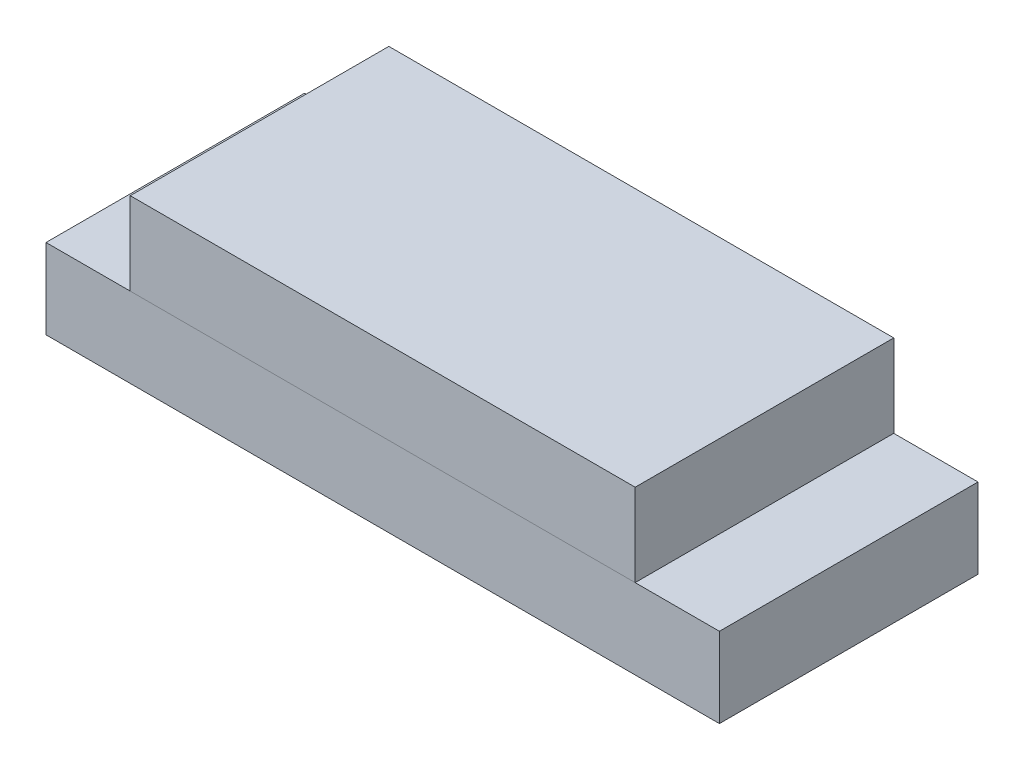
ISO-10303-21;
HEADER;
FILE_DESCRIPTION(('STEP AP214'),'2;1');
FILE_NAME('part.step','',(''),(''),'','','');
FILE_SCHEMA(('AUTOMOTIVE_DESIGN { 1 0 10303 214 1 1 1 1 }'));
ENDSEC;
DATA;
#1=APPLICATION_CONTEXT('core data for automotive mechanical design processes');
#2=APPLICATION_PROTOCOL_DEFINITION('international standard','automotive_design',2000,#1);
#3=PRODUCT_CONTEXT('',#1,'mechanical');
#4=PRODUCT('Part','Part','',(#3));
#5=PRODUCT_RELATED_PRODUCT_CATEGORY('part','',(#4));
#6=PRODUCT_DEFINITION_FORMATION('','',#4);
#7=PRODUCT_DEFINITION_CONTEXT('part definition',#1,'design');
#8=PRODUCT_DEFINITION('design','',#6,#7);
#9=PRODUCT_DEFINITION_SHAPE('','',#8);
#10=(LENGTH_UNIT() NAMED_UNIT(*) SI_UNIT(.MILLI.,.METRE.));
#11=(NAMED_UNIT(*) PLANE_ANGLE_UNIT() SI_UNIT($,.RADIAN.));
#12=(NAMED_UNIT(*) SI_UNIT($,.STERADIAN.) SOLID_ANGLE_UNIT());
#13=UNCERTAINTY_MEASURE_WITH_UNIT(LENGTH_MEASURE(1.E-05),#10,'distance_accuracy_value','');
#14=(GEOMETRIC_REPRESENTATION_CONTEXT(3) GLOBAL_UNCERTAINTY_ASSIGNED_CONTEXT((#13)) GLOBAL_UNIT_ASSIGNED_CONTEXT((#10,
#11,#12)) REPRESENTATION_CONTEXT('',''));
#15=CARTESIAN_POINT('',(0.,0.,0.));
#16=DIRECTION('',(0.,0.,1.));
#17=DIRECTION('',(1.,0.,0.));
#18=AXIS2_PLACEMENT_3D('',#15,#16,#17);
#19=CARTESIAN_POINT('',(56.134,7.62,24.638));
#20=DIRECTION('',(1.,0.,0.));
#21=DIRECTION('',(0.,0.,-1.));
#22=AXIS2_PLACEMENT_3D('',#19,#20,#21);
#23=PLANE('',#22);
#24=DIRECTION('',(0.,-1.,0.));
#25=VECTOR('',#24,1.);
#26=CARTESIAN_POINT('',(56.134,7.62,0.));
#27=LINE('',#26,#25);
#28=CARTESIAN_POINT('',(56.134,15.494,0.));
#29=VERTEX_POINT('',#28);
#30=CARTESIAN_POINT('',(56.134,7.62,0.));
#31=VERTEX_POINT('',#30);
#32=EDGE_CURVE('E111',#29,#31,#27,.T.);
#33=ORIENTED_EDGE('',*,*,#32,.F.);
#34=DIRECTION('',(0.,0.,-1.));
#35=VECTOR('',#34,1.);
#36=CARTESIAN_POINT('',(56.134,15.494,24.638));
#37=LINE('',#36,#35);
#38=CARTESIAN_POINT('',(56.134,15.494,24.638));
#39=VERTEX_POINT('',#38);
#40=EDGE_CURVE('E12',#39,#29,#37,.T.);
#41=ORIENTED_EDGE('',*,*,#40,.F.);
#42=DIRECTION('',(0.,-1.,0.));
#43=VECTOR('',#42,1.);
#44=CARTESIAN_POINT('',(56.134,7.62,24.638));
#45=LINE('',#44,#43);
#46=CARTESIAN_POINT('',(56.134,7.62,24.638));
#47=VERTEX_POINT('',#46);
#48=EDGE_CURVE('E105',#39,#47,#45,.T.);
#49=ORIENTED_EDGE('',*,*,#48,.T.);
#50=DIRECTION('',(0.,0.,-1.));
#51=VECTOR('',#50,1.);
#52=CARTESIAN_POINT('',(56.134,7.62,24.638));
#53=LINE('',#52,#51);
#54=EDGE_CURVE('E50',#47,#31,#53,.T.);
#55=ORIENTED_EDGE('',*,*,#54,.T.);
#56=EDGE_LOOP('',(#33,#41,#49,#55));
#57=FACE_BOUND('',#56,.T.);
#58=ADVANCED_FACE('F47',(#57),#23,.T.);
#59=CARTESIAN_POINT('',(56.134,15.494,24.638));
#60=DIRECTION('',(0.,1.,0.));
#61=DIRECTION('',(-1.,0.,0.));
#62=AXIS2_PLACEMENT_3D('',#59,#60,#61);
#63=PLANE('',#62);
#64=DIRECTION('',(1.,0.,0.));
#65=VECTOR('',#64,1.);
#66=CARTESIAN_POINT('',(56.134,15.494,0.));
#67=LINE('',#66,#65);
#68=CARTESIAN_POINT('',(8.0264,15.494,0.));
#69=VERTEX_POINT('',#68);
#70=EDGE_CURVE('E107',#69,#29,#67,.T.);
#71=ORIENTED_EDGE('',*,*,#70,.F.);
#72=DIRECTION('',(0.,0.,-1.));
#73=VECTOR('',#72,1.);
#74=CARTESIAN_POINT('',(8.0264,15.494,24.638));
#75=LINE('',#74,#73);
#76=CARTESIAN_POINT('',(8.0264,15.494,24.638));
#77=VERTEX_POINT('',#76);
#78=EDGE_CURVE('E56',#77,#69,#75,.T.);
#79=ORIENTED_EDGE('',*,*,#78,.F.);
#80=DIRECTION('',(1.,0.,0.));
#81=VECTOR('',#80,1.);
#82=CARTESIAN_POINT('',(56.134,15.494,24.638));
#83=LINE('',#82,#81);
#84=EDGE_CURVE('E102',#77,#39,#83,.T.);
#85=ORIENTED_EDGE('',*,*,#84,.T.);
#86=ORIENTED_EDGE('',*,*,#40,.T.);
#87=EDGE_LOOP('',(#71,#79,#85,#86));
#88=FACE_BOUND('',#87,.T.);
#89=ADVANCED_FACE('F121',(#88),#63,.T.);
#90=CARTESIAN_POINT('',(8.0264,7.62000000000001,24.638));
#91=DIRECTION('',(-1.,0.,0.));
#92=DIRECTION('',(0.,0.,1.));
#93=AXIS2_PLACEMENT_3D('',#90,#91,#92);
#94=PLANE('',#93);
#95=DIRECTION('',(0.,1.,0.));
#96=VECTOR('',#95,1.);
#97=CARTESIAN_POINT('',(8.0264,7.62000000000001,0.));
#98=LINE('',#97,#96);
#99=CARTESIAN_POINT('',(8.0264,7.62000000000001,0.));
#100=VERTEX_POINT('',#99);
#101=EDGE_CURVE('E97',#100,#69,#98,.T.);
#102=ORIENTED_EDGE('',*,*,#101,.F.);
#103=DIRECTION('',(0.,0.,-1.));
#104=VECTOR('',#103,1.);
#105=CARTESIAN_POINT('',(8.0264,7.62000000000001,24.638));
#106=LINE('',#105,#104);
#107=CARTESIAN_POINT('',(8.0264,7.62000000000001,24.638));
#108=VERTEX_POINT('',#107);
#109=EDGE_CURVE('E92',#108,#100,#106,.T.);
#110=ORIENTED_EDGE('',*,*,#109,.F.);
#111=DIRECTION('',(0.,1.,0.));
#112=VECTOR('',#111,1.);
#113=CARTESIAN_POINT('',(8.0264,7.62000000000001,24.638));
#114=LINE('',#113,#112);
#115=EDGE_CURVE('E95',#108,#77,#114,.T.);
#116=ORIENTED_EDGE('',*,*,#115,.T.);
#117=ORIENTED_EDGE('',*,*,#78,.T.);
#118=EDGE_LOOP('',(#102,#110,#116,#117));
#119=FACE_BOUND('',#118,.T.);
#120=ADVANCED_FACE('F94',(#119),#94,.T.);
#121=CARTESIAN_POINT('',(56.134,7.62,24.638));
#122=DIRECTION('',(0.,-1.,0.));
#123=DIRECTION('',(1.,0.,0.));
#124=AXIS2_PLACEMENT_3D('',#121,#122,#123);
#125=PLANE('',#124);
#126=DIRECTION('',(-1.,0.,0.));
#127=VECTOR('',#126,1.);
#128=CARTESIAN_POINT('',(56.134,7.62,0.));
#129=LINE('',#128,#127);
#130=EDGE_CURVE('E114',#31,#100,#129,.T.);
#131=ORIENTED_EDGE('',*,*,#130,.F.);
#132=ORIENTED_EDGE('',*,*,#54,.F.);
#133=DIRECTION('',(-1.,0.,0.));
#134=VECTOR('',#133,1.);
#135=CARTESIAN_POINT('',(56.134,7.62,24.638));
#136=LINE('',#135,#134);
#137=EDGE_CURVE('E101',#47,#108,#136,.T.);
#138=ORIENTED_EDGE('',*,*,#137,.T.);
#139=ORIENTED_EDGE('',*,*,#109,.T.);
#140=EDGE_LOOP('',(#131,#132,#138,#139));
#141=FACE_BOUND('',#140,.T.);
#142=ADVANCED_FACE('F104',(#141),#125,.T.);
#143=CARTESIAN_POINT('',(0.,0.,24.638));
#144=DIRECTION('',(0.,0.,1.));
#145=DIRECTION('',(1.,0.,0.));
#146=AXIS2_PLACEMENT_3D('',#143,#144,#145);
#147=PLANE('',#146);
#148=ORIENTED_EDGE('',*,*,#48,.F.);
#149=ORIENTED_EDGE('',*,*,#84,.F.);
#150=ORIENTED_EDGE('',*,*,#115,.F.);
#151=ORIENTED_EDGE('',*,*,#137,.F.);
#152=EDGE_LOOP('',(#148,#149,#150,#151));
#153=FACE_BOUND('',#152,.T.);
#154=ADVANCED_FACE('F100',(#153),#147,.T.);
#155=CARTESIAN_POINT('',(0.,0.,0.));
#156=DIRECTION('',(0.,0.,1.));
#157=DIRECTION('',(1.,0.,0.));
#158=AXIS2_PLACEMENT_3D('',#155,#156,#157);
#159=PLANE('',#158);
#160=ORIENTED_EDGE('',*,*,#32,.T.);
#161=ORIENTED_EDGE('',*,*,#130,.T.);
#162=ORIENTED_EDGE('',*,*,#101,.T.);
#163=ORIENTED_EDGE('',*,*,#70,.T.);
#164=EDGE_LOOP('',(#160,#161,#162,#163));
#165=FACE_BOUND('',#164,.T.);
#166=ADVANCED_FACE('F120',(#165),#159,.F.);
#167=CLOSED_SHELL('',(#58,#89,#120,#142,#154,#166));
#168=MANIFOLD_SOLID_BREP('B2',#167);
#169=CARTESIAN_POINT('',(64.1604,7.62,24.638));
#170=DIRECTION('',(1.,0.,0.));
#171=DIRECTION('',(0.,0.,-1.));
#172=AXIS2_PLACEMENT_3D('',#169,#170,#171);
#173=PLANE('',#172);
#174=DIRECTION('',(0.,-1.,0.));
#175=VECTOR('',#174,1.);
#176=CARTESIAN_POINT('',(64.1604,7.62,0.));
#177=LINE('',#176,#175);
#178=CARTESIAN_POINT('',(64.1604,7.62,0.));
#179=VERTEX_POINT('',#178);
#180=CARTESIAN_POINT('',(64.1604,0.,0.));
#181=VERTEX_POINT('',#180);
#182=EDGE_CURVE('E236',#179,#181,#177,.T.);
#183=ORIENTED_EDGE('',*,*,#182,.F.);
#184=DIRECTION('',(0.,0.,-1.));
#185=VECTOR('',#184,1.);
#186=CARTESIAN_POINT('',(64.1604,7.62,24.638));
#187=LINE('',#186,#185);
#188=CARTESIAN_POINT('',(64.1604,7.62,24.638));
#189=VERTEX_POINT('',#188);
#190=EDGE_CURVE('E45',#189,#179,#187,.T.);
#191=ORIENTED_EDGE('',*,*,#190,.F.);
#192=DIRECTION('',(0.,-1.,0.));
#193=VECTOR('',#192,1.);
#194=CARTESIAN_POINT('',(64.1604,7.62,24.638));
#195=LINE('',#194,#193);
#196=CARTESIAN_POINT('',(64.1604,0.,24.638));
#197=VERTEX_POINT('',#196);
#198=EDGE_CURVE('E231',#189,#197,#195,.T.);
#199=ORIENTED_EDGE('',*,*,#198,.T.);
#200=DIRECTION('',(0.,0.,-1.));
#201=VECTOR('',#200,1.);
#202=CARTESIAN_POINT('',(64.1604,0.,24.638));
#203=LINE('',#202,#201);
#204=EDGE_CURVE('E174',#197,#181,#203,.T.);
#205=ORIENTED_EDGE('',*,*,#204,.T.);
#206=EDGE_LOOP('',(#183,#191,#199,#205));
#207=FACE_BOUND('',#206,.T.);
#208=ADVANCED_FACE('F171',(#207),#173,.T.);
#209=CARTESIAN_POINT('',(64.1604,7.62,24.638));
#210=DIRECTION('',(0.,-1.,0.));
#211=DIRECTION('',(0.,0.,-1.));
#212=AXIS2_PLACEMENT_3D('',#209,#210,#211);
#213=PLANE('',#212);
#214=DIRECTION('',(-1.,0.,0.));
#215=VECTOR('',#214,1.);
#216=CARTESIAN_POINT('',(64.1604,7.62,0.));
#217=LINE('',#216,#215);
#218=CARTESIAN_POINT('',(0.,7.62,0.));
#219=VERTEX_POINT('',#218);
#220=EDGE_CURVE('E204',#179,#219,#217,.T.);
#221=ORIENTED_EDGE('',*,*,#220,.T.);
#222=DIRECTION('',(0.,0.,-1.));
#223=VECTOR('',#222,1.);
#224=CARTESIAN_POINT('',(0.,7.62,24.638));
#225=LINE('',#224,#223);
#226=CARTESIAN_POINT('',(0.,7.62,24.638));
#227=VERTEX_POINT('',#226);
#228=EDGE_CURVE('E180',#227,#219,#225,.T.);
#229=ORIENTED_EDGE('',*,*,#228,.F.);
#230=DIRECTION('',(-1.,0.,0.));
#231=VECTOR('',#230,1.);
#232=CARTESIAN_POINT('',(64.1604,7.62,24.638));
#233=LINE('',#232,#231);
#234=EDGE_CURVE('E221',#189,#227,#233,.T.);
#235=ORIENTED_EDGE('',*,*,#234,.F.);
#236=ORIENTED_EDGE('',*,*,#190,.T.);
#237=EDGE_LOOP('',(#221,#229,#235,#236));
#238=FACE_BOUND('',#237,.T.);
#239=ADVANCED_FACE('F246',(#238),#213,.F.);
#240=CARTESIAN_POINT('',(0.,7.62,24.638));
#241=DIRECTION('',(1.,0.,0.));
#242=DIRECTION('',(0.,0.,-1.));
#243=AXIS2_PLACEMENT_3D('',#240,#241,#242);
#244=PLANE('',#243);
#245=DIRECTION('',(0.,-1.,0.));
#246=VECTOR('',#245,1.);
#247=CARTESIAN_POINT('',(0.,7.62,0.));
#248=LINE('',#247,#246);
#249=CARTESIAN_POINT('',(0.,0.,0.));
#250=VERTEX_POINT('',#249);
#251=EDGE_CURVE('E228',#219,#250,#248,.T.);
#252=ORIENTED_EDGE('',*,*,#251,.T.);
#253=DIRECTION('',(0.,0.,-1.));
#254=VECTOR('',#253,1.);
#255=CARTESIAN_POINT('',(0.,0.,24.638));
#256=LINE('',#255,#254);
#257=CARTESIAN_POINT('',(0.,0.,24.638));
#258=VERTEX_POINT('',#257);
#259=EDGE_CURVE('E225',#258,#250,#256,.T.);
#260=ORIENTED_EDGE('',*,*,#259,.F.);
#261=DIRECTION('',(0.,-1.,0.));
#262=VECTOR('',#261,1.);
#263=CARTESIAN_POINT('',(0.,7.62,24.638));
#264=LINE('',#263,#262);
#265=EDGE_CURVE('E216',#227,#258,#264,.T.);
#266=ORIENTED_EDGE('',*,*,#265,.F.);
#267=ORIENTED_EDGE('',*,*,#228,.T.);
#268=EDGE_LOOP('',(#252,#260,#266,#267));
#269=FACE_BOUND('',#268,.T.);
#270=ADVANCED_FACE('F226',(#269),#244,.F.);
#271=CARTESIAN_POINT('',(64.1604,0.,24.638));
#272=DIRECTION('',(0.,-1.,0.));
#273=DIRECTION('',(0.,0.,-1.));
#274=AXIS2_PLACEMENT_3D('',#271,#272,#273);
#275=PLANE('',#274);
#276=DIRECTION('',(-1.,0.,0.));
#277=VECTOR('',#276,1.);
#278=CARTESIAN_POINT('',(64.1604,0.,0.));
#279=LINE('',#278,#277);
#280=EDGE_CURVE('E239',#181,#250,#279,.T.);
#281=ORIENTED_EDGE('',*,*,#280,.F.);
#282=ORIENTED_EDGE('',*,*,#204,.F.);
#283=DIRECTION('',(-1.,0.,0.));
#284=VECTOR('',#283,1.);
#285=CARTESIAN_POINT('',(64.1604,0.,24.638));
#286=LINE('',#285,#284);
#287=EDGE_CURVE('E220',#197,#258,#286,.T.);
#288=ORIENTED_EDGE('',*,*,#287,.T.);
#289=ORIENTED_EDGE('',*,*,#259,.T.);
#290=EDGE_LOOP('',(#281,#282,#288,#289));
#291=FACE_BOUND('',#290,.T.);
#292=ADVANCED_FACE('F230',(#291),#275,.T.);
#293=CARTESIAN_POINT('',(0.,0.,24.638));
#294=DIRECTION('',(0.,0.,-1.));
#295=DIRECTION('',(-1.,0.,0.));
#296=AXIS2_PLACEMENT_3D('',#293,#294,#295);
#297=PLANE('',#296);
#298=ORIENTED_EDGE('',*,*,#198,.F.);
#299=ORIENTED_EDGE('',*,*,#234,.T.);
#300=ORIENTED_EDGE('',*,*,#265,.T.);
#301=ORIENTED_EDGE('',*,*,#287,.F.);
#302=EDGE_LOOP('',(#298,#299,#300,#301));
#303=FACE_BOUND('',#302,.T.);
#304=ADVANCED_FACE('F219',(#303),#297,.F.);
#305=CARTESIAN_POINT('',(0.,0.,0.));
#306=DIRECTION('',(0.,0.,-1.));
#307=DIRECTION('',(-1.,0.,0.));
#308=AXIS2_PLACEMENT_3D('',#305,#306,#307);
#309=PLANE('',#308);
#310=ORIENTED_EDGE('',*,*,#182,.T.);
#311=ORIENTED_EDGE('',*,*,#280,.T.);
#312=ORIENTED_EDGE('',*,*,#251,.F.);
#313=ORIENTED_EDGE('',*,*,#220,.F.);
#314=EDGE_LOOP('',(#310,#311,#312,#313));
#315=FACE_BOUND('',#314,.T.);
#316=ADVANCED_FACE('F244',(#315),#309,.T.);
#317=CLOSED_SHELL('',(#208,#239,#270,#292,#304,#316));
#318=MANIFOLD_SOLID_BREP('B6',#317);
#319=ADVANCED_BREP_SHAPE_REPRESENTATION('',(#18,#168,#318),#14);
#320=SHAPE_DEFINITION_REPRESENTATION(#9,#319);
ENDSEC;
END-ISO-10303-21;
